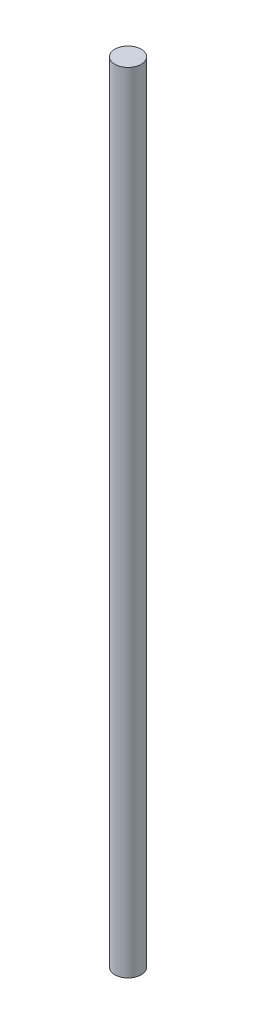
ISO-10303-21;
HEADER;
FILE_DESCRIPTION(('STEP AP214'),'2;1');
FILE_NAME('part.step','',(''),(''),'','','');
FILE_SCHEMA(('AUTOMOTIVE_DESIGN { 1 0 10303 214 1 1 1 1 }'));
ENDSEC;
DATA;
#1=APPLICATION_CONTEXT('core data for automotive mechanical design processes');
#2=APPLICATION_PROTOCOL_DEFINITION('international standard','automotive_design',2000,#1);
#3=PRODUCT_CONTEXT('',#1,'mechanical');
#4=PRODUCT('Part','Part','',(#3));
#5=PRODUCT_RELATED_PRODUCT_CATEGORY('part','',(#4));
#6=PRODUCT_DEFINITION_FORMATION('','',#4);
#7=PRODUCT_DEFINITION_CONTEXT('part definition',#1,'design');
#8=PRODUCT_DEFINITION('design','',#6,#7);
#9=PRODUCT_DEFINITION_SHAPE('','',#8);
#10=(LENGTH_UNIT() NAMED_UNIT(*) SI_UNIT(.MILLI.,.METRE.));
#11=(NAMED_UNIT(*) PLANE_ANGLE_UNIT() SI_UNIT($,.RADIAN.));
#12=(NAMED_UNIT(*) SI_UNIT($,.STERADIAN.) SOLID_ANGLE_UNIT());
#13=UNCERTAINTY_MEASURE_WITH_UNIT(LENGTH_MEASURE(1.E-05),#10,'distance_accuracy_value','');
#14=(GEOMETRIC_REPRESENTATION_CONTEXT(3) GLOBAL_UNCERTAINTY_ASSIGNED_CONTEXT((#13)) GLOBAL_UNIT_ASSIGNED_CONTEXT((#10,
#11,#12)) REPRESENTATION_CONTEXT('',''));
#15=CARTESIAN_POINT('',(0.,0.,0.));
#16=DIRECTION('',(0.,0.,1.));
#17=DIRECTION('',(1.,0.,0.));
#18=AXIS2_PLACEMENT_3D('',#15,#16,#17);
#19=CARTESIAN_POINT('',(0.,90.,0.));
#20=DIRECTION('',(0.,-1.,0.));
#21=DIRECTION('',(0.,0.,-1.));
#22=AXIS2_PLACEMENT_3D('',#19,#20,#21);
#23=CYLINDRICAL_SURFACE('',#22,1.5);
#24=CARTESIAN_POINT('',(0.,90.,0.));
#25=DIRECTION('',(0.,1.,0.));
#26=DIRECTION('',(0.,0.,1.));
#27=AXIS2_PLACEMENT_3D('',#24,#25,#26);
#28=CIRCLE('',#27,1.5);
#29=CARTESIAN_POINT('',(0.,90.,-1.5));
#30=VERTEX_POINT('',#29);
#31=EDGE_CURVE('E10',#30,#30,#28,.T.);
#32=CARTESIAN_POINT('',(0.,0.,0.));
#33=DIRECTION('',(0.,1.,0.));
#34=DIRECTION('',(0.,0.,1.));
#35=AXIS2_PLACEMENT_3D('',#32,#33,#34);
#36=CIRCLE('',#35,1.5);
#37=CARTESIAN_POINT('',(0.,0.,-1.5));
#38=VERTEX_POINT('',#37);
#39=EDGE_CURVE('E42',#38,#38,#36,.T.);
#40=CARTESIAN_POINT('',(0.,90.,-1.5));
#41=CARTESIAN_POINT('',(0.,89.0625,-1.5));
#42=CARTESIAN_POINT('',(0.,88.125,-1.5));
#43=CARTESIAN_POINT('',(0.,86.25,-1.5));
#44=CARTESIAN_POINT('',(0.,85.3125,-1.5));
#45=CARTESIAN_POINT('',(0.,83.4375,-1.5));
#46=CARTESIAN_POINT('',(0.,82.5,-1.5));
#47=CARTESIAN_POINT('',(0.,80.625,-1.5));
#48=CARTESIAN_POINT('',(0.,79.6875,-1.5));
#49=CARTESIAN_POINT('',(0.,77.8125,-1.5));
#50=CARTESIAN_POINT('',(0.,76.875,-1.5));
#51=CARTESIAN_POINT('',(0.,75.,-1.5));
#52=CARTESIAN_POINT('',(0.,74.0625,-1.5));
#53=CARTESIAN_POINT('',(0.,72.1875,-1.5));
#54=CARTESIAN_POINT('',(0.,71.25,-1.5));
#55=CARTESIAN_POINT('',(0.,69.375,-1.5));
#56=CARTESIAN_POINT('',(0.,68.4375,-1.5));
#57=CARTESIAN_POINT('',(0.,66.5625,-1.5));
#58=CARTESIAN_POINT('',(0.,65.625,-1.5));
#59=CARTESIAN_POINT('',(0.,63.75,-1.5));
#60=CARTESIAN_POINT('',(0.,62.8125,-1.5));
#61=CARTESIAN_POINT('',(0.,60.9375,-1.5));
#62=CARTESIAN_POINT('',(0.,60.,-1.5));
#63=CARTESIAN_POINT('',(0.,58.125,-1.5));
#64=CARTESIAN_POINT('',(0.,57.1875,-1.5));
#65=CARTESIAN_POINT('',(0.,55.3125,-1.5));
#66=CARTESIAN_POINT('',(0.,54.375,-1.5));
#67=CARTESIAN_POINT('',(0.,52.5,-1.5));
#68=CARTESIAN_POINT('',(0.,51.5625,-1.5));
#69=CARTESIAN_POINT('',(0.,49.6875,-1.5));
#70=CARTESIAN_POINT('',(0.,48.75,-1.5));
#71=CARTESIAN_POINT('',(0.,46.875,-1.5));
#72=CARTESIAN_POINT('',(0.,45.9375,-1.5));
#73=CARTESIAN_POINT('',(0.,44.0625,-1.5));
#74=CARTESIAN_POINT('',(0.,43.125,-1.5));
#75=CARTESIAN_POINT('',(0.,41.25,-1.5));
#76=CARTESIAN_POINT('',(0.,40.3125,-1.5));
#77=CARTESIAN_POINT('',(0.,38.4375,-1.5));
#78=CARTESIAN_POINT('',(0.,37.5,-1.5));
#79=CARTESIAN_POINT('',(0.,35.625,-1.5));
#80=CARTESIAN_POINT('',(0.,34.6875,-1.5));
#81=CARTESIAN_POINT('',(0.,32.8125,-1.5));
#82=CARTESIAN_POINT('',(0.,31.875,-1.5));
#83=CARTESIAN_POINT('',(0.,30.,-1.5));
#84=CARTESIAN_POINT('',(0.,29.0625,-1.5));
#85=CARTESIAN_POINT('',(0.,27.1875,-1.5));
#86=CARTESIAN_POINT('',(0.,26.25,-1.5));
#87=CARTESIAN_POINT('',(0.,24.375,-1.5));
#88=CARTESIAN_POINT('',(0.,23.4375,-1.5));
#89=CARTESIAN_POINT('',(0.,21.5625,-1.5));
#90=CARTESIAN_POINT('',(0.,20.625,-1.5));
#91=CARTESIAN_POINT('',(0.,18.75,-1.5));
#92=CARTESIAN_POINT('',(0.,17.8125,-1.5));
#93=CARTESIAN_POINT('',(0.,15.9375,-1.5));
#94=CARTESIAN_POINT('',(0.,15.,-1.5));
#95=CARTESIAN_POINT('',(0.,13.125,-1.5));
#96=CARTESIAN_POINT('',(0.,12.1875,-1.5));
#97=CARTESIAN_POINT('',(0.,10.3125,-1.5));
#98=CARTESIAN_POINT('',(0.,9.37499999999999,-1.5));
#99=CARTESIAN_POINT('',(0.,7.49999999999999,-1.5));
#100=CARTESIAN_POINT('',(0.,6.56249999999999,-1.5));
#101=CARTESIAN_POINT('',(0.,4.68749999999999,-1.5));
#102=CARTESIAN_POINT('',(0.,3.74999999999998,-1.5));
#103=CARTESIAN_POINT('',(0.,1.87499999999998,-1.5));
#104=CARTESIAN_POINT('',(0.,0.937499999999986,-1.5));
#105=CARTESIAN_POINT('',(0.,0.,-1.5));
#106=B_SPLINE_CURVE_WITH_KNOTS('',3,(#40,#41,#42,#43,#44,#45,#46,#47,#48,#49,#50,#51,#52,#53,
#54,#55,#56,#57,#58,#59,#60,#61,#62,#63,#64,#65,#66,#67,#68,#69,#70,#71,#72,#73,#74,#75,#76,#77,
#78,#79,#80,#81,#82,#83,#84,#85,#86,#87,#88,#89,#90,#91,#92,#93,#94,#95,#96,#97,#98,#99,#100,
#101,#102,#103,#104,#105),.UNSPECIFIED.,.F.,.F.,(4,2,2,2,2,2,2,2,2,2,2,2,2,2,2,2,2,2,2,2,2,2,2,
2,2,2,2,2,2,2,2,2,4),(0.,2.81250000000001,5.62500000000001,8.43750000000001,11.25,14.0625,
16.875,19.6875,22.5,25.3125,28.125,30.9375,33.75,36.5625,39.375,42.1875,45.,47.8125,50.625,
53.4375,56.25,59.0625,61.875,64.6875,67.5,70.3125,73.125,75.9375,78.75,81.5625,84.375,87.1875,
90.),.UNSPECIFIED.);
#107=EDGE_CURVE('BSEAM39',#30,#38,#106,.T.);
#108=ORIENTED_EDGE('',*,*,#31,.F.);
#109=ORIENTED_EDGE('',*,*,#39,.T.);
#110=ORIENTED_EDGE('',*,*,#107,.T.);
#111=ORIENTED_EDGE('',*,*,#107,.F.);
#112=EDGE_LOOP('',(#108,#110,#109,#111));
#113=FACE_BOUND('',#112,.T.);
#114=ADVANCED_FACE('F39',(#113),#23,.T.);
#115=CARTESIAN_POINT('',(0.,90.,0.));
#116=DIRECTION('',(0.,1.,0.));
#117=DIRECTION('',(0.,0.,1.));
#118=AXIS2_PLACEMENT_3D('',#115,#116,#117);
#119=PLANE('',#118);
#120=ORIENTED_EDGE('',*,*,#31,.T.);
#121=EDGE_LOOP('',(#120));
#122=FACE_BOUND('',#121,.T.);
#123=ADVANCED_FACE('F54',(#122),#119,.T.);
#124=CARTESIAN_POINT('',(0.,0.,0.));
#125=DIRECTION('',(0.,1.,0.));
#126=DIRECTION('',(0.,0.,1.));
#127=AXIS2_PLACEMENT_3D('',#124,#125,#126);
#128=PLANE('',#127);
#129=ORIENTED_EDGE('',*,*,#39,.F.);
#130=EDGE_LOOP('',(#129));
#131=FACE_BOUND('',#130,.T.);
#132=ADVANCED_FACE('F52',(#131),#128,.F.);
#133=CLOSED_SHELL('',(#114,#123,#132));
#134=MANIFOLD_SOLID_BREP('B2',#133);
#135=ADVANCED_BREP_SHAPE_REPRESENTATION('',(#18,#134),#14);
#136=SHAPE_DEFINITION_REPRESENTATION(#9,#135);
ENDSEC;
END-ISO-10303-21;
